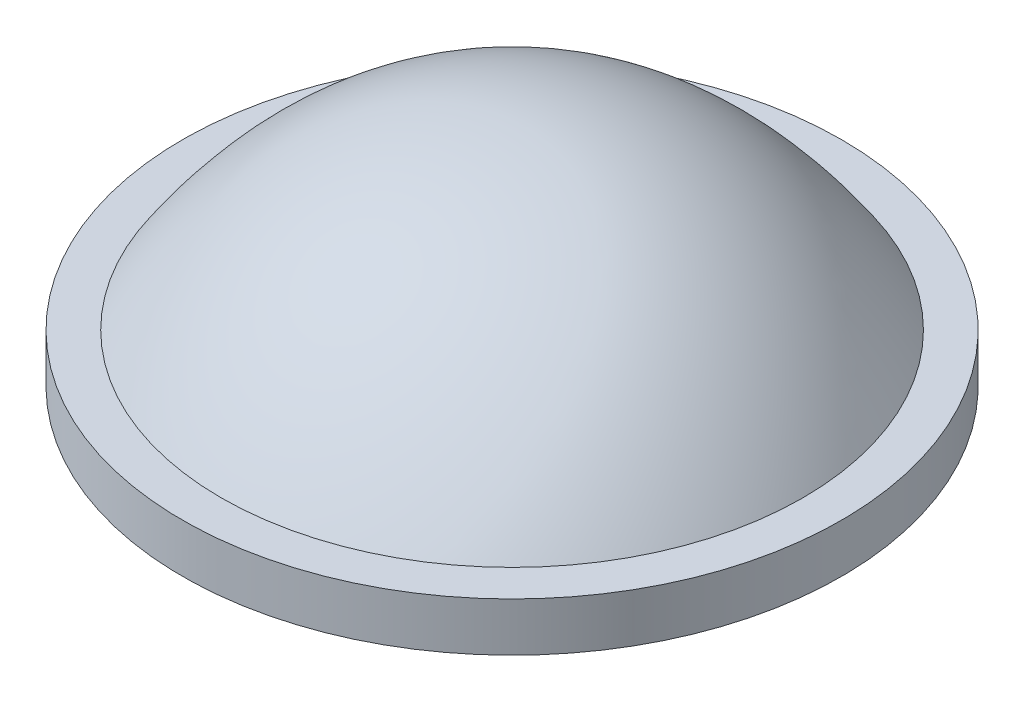
ISO-10303-21;
HEADER;
FILE_DESCRIPTION(('STEP AP214'),'2;1');
FILE_NAME('part.step','',(''),(''),'','','');
FILE_SCHEMA(('AUTOMOTIVE_DESIGN { 1 0 10303 214 1 1 1 1 }'));
ENDSEC;
DATA;
#1=APPLICATION_CONTEXT('core data for automotive mechanical design processes');
#2=APPLICATION_PROTOCOL_DEFINITION('international standard','automotive_design',2000,#1);
#3=PRODUCT_CONTEXT('',#1,'mechanical');
#4=PRODUCT('Part','Part','',(#3));
#5=PRODUCT_RELATED_PRODUCT_CATEGORY('part','',(#4));
#6=PRODUCT_DEFINITION_FORMATION('','',#4);
#7=PRODUCT_DEFINITION_CONTEXT('part definition',#1,'design');
#8=PRODUCT_DEFINITION('design','',#6,#7);
#9=PRODUCT_DEFINITION_SHAPE('','',#8);
#10=(LENGTH_UNIT() NAMED_UNIT(*) SI_UNIT(.MILLI.,.METRE.));
#11=(NAMED_UNIT(*) PLANE_ANGLE_UNIT() SI_UNIT($,.RADIAN.));
#12=(NAMED_UNIT(*) SI_UNIT($,.STERADIAN.) SOLID_ANGLE_UNIT());
#13=UNCERTAINTY_MEASURE_WITH_UNIT(LENGTH_MEASURE(1.E-05),#10,'distance_accuracy_value','');
#14=(GEOMETRIC_REPRESENTATION_CONTEXT(3) GLOBAL_UNCERTAINTY_ASSIGNED_CONTEXT((#13)) GLOBAL_UNIT_ASSIGNED_CONTEXT((#10,
#11,#12)) REPRESENTATION_CONTEXT('',''));
#15=CARTESIAN_POINT('',(0.,0.,0.));
#16=DIRECTION('',(0.,0.,1.));
#17=DIRECTION('',(1.,0.,0.));
#18=AXIS2_PLACEMENT_3D('',#15,#16,#17);
#19=CARTESIAN_POINT('',(0.,0.,0.));
#20=DIRECTION('',(0.,1.,0.));
#21=DIRECTION('',(0.,0.,1.));
#22=AXIS2_PLACEMENT_3D('',#19,#20,#21);
#23=PLANE('',#22);
#24=CARTESIAN_POINT('',(0.,0.,0.));
#25=DIRECTION('',(0.,-1.,0.));
#26=DIRECTION('',(0.,0.,-1.));
#27=AXIS2_PLACEMENT_3D('',#24,#25,#26);
#28=CIRCLE('',#27,11.5);
#29=CARTESIAN_POINT('',(0.,0.,-11.5));
#30=VERTEX_POINT('',#29);
#31=EDGE_CURVE('E72',#30,#30,#28,.T.);
#32=ORIENTED_EDGE('',*,*,#31,.T.);
#33=EDGE_LOOP('',(#32));
#34=FACE_BOUND('',#33,.T.);
#35=ADVANCED_FACE('F45',(#34),#23,.F.);
#36=CARTESIAN_POINT('',(0.,7.8,0.));
#37=CARTESIAN_POINT('',(0.,7.8,6.08134161139191));
#38=CARTESIAN_POINT('',(0.,1.7,10.15));
#39=B_SPLINE_CURVE_WITH_KNOTS('',2,(#36,#37,#38),.UNSPECIFIED.,.F.,.F.,(3,3),(0.,1.),.UNSPECIFIED.);
#40=CARTESIAN_POINT('',(0.,0.,0.));
#41=DIRECTION('',(0.,-1.,0.));
#42=AXIS1_PLACEMENT('',#40,#41);
#43=SURFACE_OF_REVOLUTION('',#39,#42);
#44=CARTESIAN_POINT('',(0.,1.7,0.));
#45=DIRECTION('',(0.,-1.,0.));
#46=DIRECTION('',(0.,0.,-1.));
#47=AXIS2_PLACEMENT_3D('',#44,#45,#46);
#48=CIRCLE('',#47,10.15);
#49=CARTESIAN_POINT('',(0.,1.7,-10.15));
#50=VERTEX_POINT('',#49);
#51=EDGE_CURVE('E11',#50,#50,#48,.T.);
#52=ORIENTED_EDGE('',*,*,#51,.F.);
#53=EDGE_LOOP('',(#52));
#54=FACE_BOUND('',#53,.T.);
#55=CARTESIAN_POINT('',(0.,7.8,0.));
#56=VERTEX_POINT('',#55);
#57=VERTEX_LOOP('',#56);
#58=FACE_BOUND('',#57,.T.);
#59=ADVANCED_FACE('F54',(#54,#58),#43,.T.);
#60=CARTESIAN_POINT('',(0.,1.7,11.5));
#61=DIRECTION('',(0.,-1.,0.));
#62=DIRECTION('',(0.,0.,-1.));
#63=AXIS2_PLACEMENT_3D('',#60,#61,#62);
#64=PLANE('',#63);
#65=CARTESIAN_POINT('',(0.,1.7,0.));
#66=DIRECTION('',(0.,-1.,0.));
#67=DIRECTION('',(0.,0.,-1.));
#68=AXIS2_PLACEMENT_3D('',#65,#66,#67);
#69=CIRCLE('',#68,11.5);
#70=CARTESIAN_POINT('',(0.,1.7,-11.5));
#71=VERTEX_POINT('',#70);
#72=EDGE_CURVE('E51',#71,#71,#69,.T.);
#73=ORIENTED_EDGE('',*,*,#72,.F.);
#74=EDGE_LOOP('',(#73));
#75=FACE_BOUND('',#74,.T.);
#76=ORIENTED_EDGE('',*,*,#51,.T.);
#77=EDGE_LOOP('',(#76));
#78=FACE_BOUND('',#77,.T.);
#79=ADVANCED_FACE('F56',(#75,#78),#64,.F.);
#80=CARTESIAN_POINT('',(0.,0.,0.));
#81=DIRECTION('',(0.,-1.,0.));
#82=DIRECTION('',(0.,0.,-1.));
#83=AXIS2_PLACEMENT_3D('',#80,#81,#82);
#84=CYLINDRICAL_SURFACE('',#83,11.5);
#85=ORIENTED_EDGE('',*,*,#31,.F.);
#86=EDGE_LOOP('',(#85));
#87=FACE_BOUND('',#86,.T.);
#88=ORIENTED_EDGE('',*,*,#72,.T.);
#89=EDGE_LOOP('',(#88));
#90=FACE_BOUND('',#89,.T.);
#91=ADVANCED_FACE('F60',(#87,#90),#84,.T.);
#92=CLOSED_SHELL('',(#35,#59,#79,#91));
#93=MANIFOLD_SOLID_BREP('B2',#92);
#94=ADVANCED_BREP_SHAPE_REPRESENTATION('',(#18,#93),#14);
#95=SHAPE_DEFINITION_REPRESENTATION(#9,#94);
ENDSEC;
END-ISO-10303-21;
